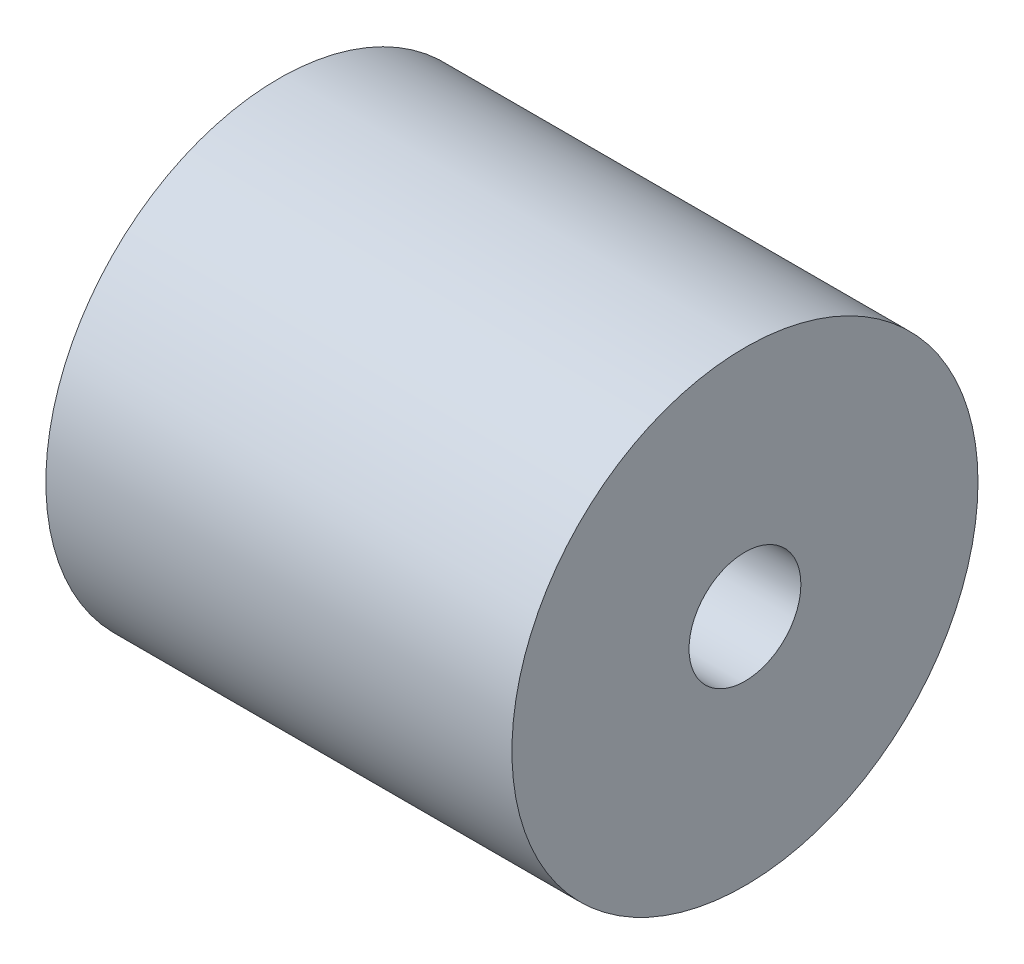
ISO-10303-21;
HEADER;
FILE_DESCRIPTION(('STEP AP214'),'2;1');
FILE_NAME('part.step','',(''),(''),'','','');
FILE_SCHEMA(('AUTOMOTIVE_DESIGN { 1 0 10303 214 1 1 1 1 }'));
ENDSEC;
DATA;
#1=APPLICATION_CONTEXT('core data for automotive mechanical design processes');
#2=APPLICATION_PROTOCOL_DEFINITION('international standard','automotive_design',2000,#1);
#3=PRODUCT_CONTEXT('',#1,'mechanical');
#4=PRODUCT('Part','Part','',(#3));
#5=PRODUCT_RELATED_PRODUCT_CATEGORY('part','',(#4));
#6=PRODUCT_DEFINITION_FORMATION('','',#4);
#7=PRODUCT_DEFINITION_CONTEXT('part definition',#1,'design');
#8=PRODUCT_DEFINITION('design','',#6,#7);
#9=PRODUCT_DEFINITION_SHAPE('','',#8);
#10=(LENGTH_UNIT() NAMED_UNIT(*) SI_UNIT(.MILLI.,.METRE.));
#11=(NAMED_UNIT(*) PLANE_ANGLE_UNIT() SI_UNIT($,.RADIAN.));
#12=(NAMED_UNIT(*) SI_UNIT($,.STERADIAN.) SOLID_ANGLE_UNIT());
#13=UNCERTAINTY_MEASURE_WITH_UNIT(LENGTH_MEASURE(1.E-05),#10,'distance_accuracy_value','');
#14=(GEOMETRIC_REPRESENTATION_CONTEXT(3) GLOBAL_UNCERTAINTY_ASSIGNED_CONTEXT((#13)) GLOBAL_UNIT_ASSIGNED_CONTEXT((#10,
#11,#12)) REPRESENTATION_CONTEXT('',''));
#15=CARTESIAN_POINT('',(0.,0.,0.));
#16=DIRECTION('',(0.,0.,1.));
#17=DIRECTION('',(1.,0.,0.));
#18=AXIS2_PLACEMENT_3D('',#15,#16,#17);
#19=CARTESIAN_POINT('',(0.,0.,0.));
#20=DIRECTION('',(1.,0.,0.));
#21=DIRECTION('',(0.,0.,-1.));
#22=AXIS2_PLACEMENT_3D('',#19,#20,#21);
#23=CYLINDRICAL_SURFACE('',#22,2.);
#24=CARTESIAN_POINT('',(-12.5,0.,0.));
#25=DIRECTION('',(1.,0.,0.));
#26=DIRECTION('',(0.,0.,-1.));
#27=AXIS2_PLACEMENT_3D('',#24,#25,#26);
#28=CIRCLE('',#27,2.);
#29=CARTESIAN_POINT('',(-12.5,0.,-2.));
#30=VERTEX_POINT('',#29);
#31=EDGE_CURVE('E53',#30,#30,#28,.T.);
#32=ORIENTED_EDGE('',*,*,#31,.T.);
#33=EDGE_LOOP('',(#32));
#34=FACE_BOUND('',#33,.T.);
#35=CARTESIAN_POINT('',(-25.,0.,0.));
#36=DIRECTION('',(1.,0.,0.));
#37=DIRECTION('',(0.,0.,-1.));
#38=AXIS2_PLACEMENT_3D('',#35,#36,#37);
#39=CIRCLE('',#38,2.);
#40=CARTESIAN_POINT('',(-25.,0.,-2.));
#41=VERTEX_POINT('',#40);
#42=EDGE_CURVE('E10',#41,#41,#39,.T.);
#43=ORIENTED_EDGE('',*,*,#42,.F.);
#44=EDGE_LOOP('',(#43));
#45=FACE_BOUND('',#44,.T.);
#46=ADVANCED_FACE('F31',(#34,#45),#23,.F.);
#47=CARTESIAN_POINT('',(-25.,2.,0.));
#48=DIRECTION('',(-1.,0.,0.));
#49=DIRECTION('',(0.,0.,1.));
#50=AXIS2_PLACEMENT_3D('',#47,#48,#49);
#51=PLANE('',#50);
#52=ORIENTED_EDGE('',*,*,#42,.T.);
#53=EDGE_LOOP('',(#52));
#54=FACE_BOUND('',#53,.T.);
#55=CARTESIAN_POINT('',(-25.,0.,0.));
#56=DIRECTION('',(1.,0.,0.));
#57=DIRECTION('',(0.,0.,-1.));
#58=AXIS2_PLACEMENT_3D('',#55,#56,#57);
#59=CIRCLE('',#58,12.5);
#60=CARTESIAN_POINT('',(-25.,0.,-12.5));
#61=VERTEX_POINT('',#60);
#62=EDGE_CURVE('E37',#61,#61,#59,.T.);
#63=ORIENTED_EDGE('',*,*,#62,.F.);
#64=EDGE_LOOP('',(#63));
#65=FACE_BOUND('',#64,.T.);
#66=ADVANCED_FACE('F71',(#54,#65),#51,.T.);
#67=CARTESIAN_POINT('',(0.,0.,0.));
#68=DIRECTION('',(1.,0.,0.));
#69=DIRECTION('',(0.,0.,-1.));
#70=AXIS2_PLACEMENT_3D('',#67,#68,#69);
#71=CYLINDRICAL_SURFACE('',#70,12.5);
#72=ORIENTED_EDGE('',*,*,#62,.T.);
#73=EDGE_LOOP('',(#72));
#74=FACE_BOUND('',#73,.T.);
#75=CARTESIAN_POINT('',(0.,0.,0.));
#76=DIRECTION('',(1.,0.,0.));
#77=DIRECTION('',(0.,0.,-1.));
#78=AXIS2_PLACEMENT_3D('',#75,#76,#77);
#79=CIRCLE('',#78,12.5);
#80=CARTESIAN_POINT('',(0.,0.,-12.5));
#81=VERTEX_POINT('',#80);
#82=EDGE_CURVE('E41',#81,#81,#79,.T.);
#83=ORIENTED_EDGE('',*,*,#82,.F.);
#84=EDGE_LOOP('',(#83));
#85=FACE_BOUND('',#84,.T.);
#86=ADVANCED_FACE('F75',(#74,#85),#71,.T.);
#87=CARTESIAN_POINT('',(0.,12.5,0.));
#88=DIRECTION('',(1.,0.,0.));
#89=DIRECTION('',(0.,0.,-1.));
#90=AXIS2_PLACEMENT_3D('',#87,#88,#89);
#91=PLANE('',#90);
#92=ORIENTED_EDGE('',*,*,#82,.T.);
#93=EDGE_LOOP('',(#92));
#94=FACE_BOUND('',#93,.T.);
#95=CARTESIAN_POINT('',(0.,0.,0.));
#96=DIRECTION('',(1.,0.,0.));
#97=DIRECTION('',(0.,0.,-1.));
#98=AXIS2_PLACEMENT_3D('',#95,#96,#97);
#99=CIRCLE('',#98,3.);
#100=CARTESIAN_POINT('',(0.,0.,-3.));
#101=VERTEX_POINT('',#100);
#102=EDGE_CURVE('E45',#101,#101,#99,.T.);
#103=ORIENTED_EDGE('',*,*,#102,.F.);
#104=EDGE_LOOP('',(#103));
#105=FACE_BOUND('',#104,.T.);
#106=ADVANCED_FACE('F67',(#94,#105),#91,.T.);
#107=CARTESIAN_POINT('',(0.,0.,0.));
#108=DIRECTION('',(1.,0.,0.));
#109=DIRECTION('',(0.,0.,-1.));
#110=AXIS2_PLACEMENT_3D('',#107,#108,#109);
#111=CYLINDRICAL_SURFACE('',#110,3.);
#112=ORIENTED_EDGE('',*,*,#102,.T.);
#113=EDGE_LOOP('',(#112));
#114=FACE_BOUND('',#113,.T.);
#115=CARTESIAN_POINT('',(-12.5,0.,0.));
#116=DIRECTION('',(1.,0.,0.));
#117=DIRECTION('',(0.,0.,-1.));
#118=AXIS2_PLACEMENT_3D('',#115,#116,#117);
#119=CIRCLE('',#118,3.);
#120=CARTESIAN_POINT('',(-12.5,0.,-3.));
#121=VERTEX_POINT('',#120);
#122=EDGE_CURVE('E50',#121,#121,#119,.T.);
#123=ORIENTED_EDGE('',*,*,#122,.F.);
#124=EDGE_LOOP('',(#123));
#125=FACE_BOUND('',#124,.T.);
#126=ADVANCED_FACE('F61',(#114,#125),#111,.F.);
#127=CARTESIAN_POINT('',(-12.5,3.,0.));
#128=DIRECTION('',(1.,0.,0.));
#129=DIRECTION('',(0.,0.,-1.));
#130=AXIS2_PLACEMENT_3D('',#127,#128,#129);
#131=PLANE('',#130);
#132=ORIENTED_EDGE('',*,*,#122,.T.);
#133=EDGE_LOOP('',(#132));
#134=FACE_BOUND('',#133,.T.);
#135=ORIENTED_EDGE('',*,*,#31,.F.);
#136=EDGE_LOOP('',(#135));
#137=FACE_BOUND('',#136,.T.);
#138=ADVANCED_FACE('F59',(#134,#137),#131,.T.);
#139=CLOSED_SHELL('',(#46,#66,#86,#106,#126,#138));
#140=MANIFOLD_SOLID_BREP('B2',#139);
#141=ADVANCED_BREP_SHAPE_REPRESENTATION('',(#18,#140),#14);
#142=SHAPE_DEFINITION_REPRESENTATION(#9,#141);
ENDSEC;
END-ISO-10303-21;
